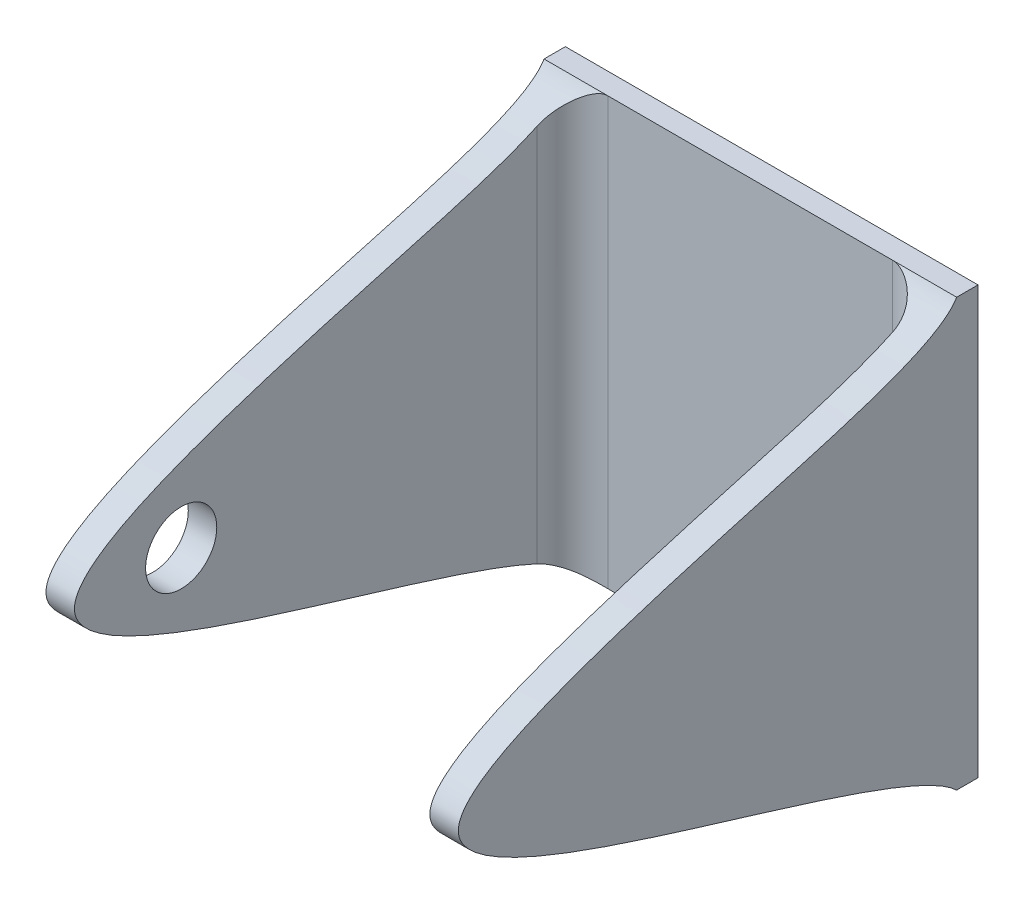
ISO-10303-21;
HEADER;
FILE_DESCRIPTION(('STEP AP214'),'2;1');
FILE_NAME('part.step','',(''),(''),'','','');
FILE_SCHEMA(('AUTOMOTIVE_DESIGN { 1 0 10303 214 1 1 1 1 }'));
ENDSEC;
DATA;
#1=APPLICATION_CONTEXT('core data for automotive mechanical design processes');
#2=APPLICATION_PROTOCOL_DEFINITION('international standard','automotive_design',2000,#1);
#3=PRODUCT_CONTEXT('',#1,'mechanical');
#4=PRODUCT('Part','Part','',(#3));
#5=PRODUCT_RELATED_PRODUCT_CATEGORY('part','',(#4));
#6=PRODUCT_DEFINITION_FORMATION('','',#4);
#7=PRODUCT_DEFINITION_CONTEXT('part definition',#1,'design');
#8=PRODUCT_DEFINITION('design','',#6,#7);
#9=PRODUCT_DEFINITION_SHAPE('','',#8);
#10=(LENGTH_UNIT() NAMED_UNIT(*) SI_UNIT(.MILLI.,.METRE.));
#11=(NAMED_UNIT(*) PLANE_ANGLE_UNIT() SI_UNIT($,.RADIAN.));
#12=(NAMED_UNIT(*) SI_UNIT($,.STERADIAN.) SOLID_ANGLE_UNIT());
#13=UNCERTAINTY_MEASURE_WITH_UNIT(LENGTH_MEASURE(1.E-05),#10,'distance_accuracy_value','');
#14=(GEOMETRIC_REPRESENTATION_CONTEXT(3) GLOBAL_UNCERTAINTY_ASSIGNED_CONTEXT((#13)) GLOBAL_UNIT_ASSIGNED_CONTEXT((#10,
#11,#12)) REPRESENTATION_CONTEXT('',''));
#15=CARTESIAN_POINT('',(0.,0.,0.));
#16=DIRECTION('',(0.,0.,1.));
#17=DIRECTION('',(1.,0.,0.));
#18=AXIS2_PLACEMENT_3D('',#15,#16,#17);
#19=CARTESIAN_POINT('',(54.,-30.,-28.));
#20=CARTESIAN_POINT('',(54.,-21.3411628219082,-18.9336377358154));
#21=CARTESIAN_POINT('',(54.,-4.31403427155989,78.5222740377525));
#22=CARTESIAN_POINT('',(54.,17.303381942778,5.87747126941268));
#23=CARTESIAN_POINT('',(54.,25.8559083263192,-25.6434168692004));
#24=CARTESIAN_POINT('',(54.,30.,-28.));
#25=B_SPLINE_CURVE_WITH_KNOTS('',3,(#19,#20,#21,#22,#23,#24),.UNSPECIFIED.,.F.,.F.,(4,1,1,4),
(0.,0.428019726830737,0.687018033348288,0.856039453661339),.UNSPECIFIED.);
#26=DIRECTION('',(-1.,0.,0.));
#27=VECTOR('',#26,1.);
#28=SURFACE_OF_LINEAR_EXTRUSION('',#25,#27);
#29=CARTESIAN_POINT('',(50.,-30.,-28.));
#30=CARTESIAN_POINT('',(50.,-21.3411628219082,-18.9336377358154));
#31=CARTESIAN_POINT('',(50.,-4.31403427155989,78.5222740377525));
#32=CARTESIAN_POINT('',(50.,17.303381942778,5.87747126941268));
#33=CARTESIAN_POINT('',(50.,25.8559083263192,-25.6434168692004));
#34=CARTESIAN_POINT('',(50.,30.,-28.));
#35=B_SPLINE_CURVE_WITH_KNOTS('',3,(#29,#30,#31,#32,#33,#34),.UNSPECIFIED.,.F.,.F.,(4,1,1,4),
(0.,0.428019726830737,0.687018033348288,0.856039453661339),.UNSPECIFIED.);
#36=CARTESIAN_POINT('',(50.,-26.9412195386749,-23.000000009792));
#37=VERTEX_POINT('',#36);
#38=CARTESIAN_POINT('',(50.,26.2475249459379,-23.0000000009633));
#39=VERTEX_POINT('',#38);
#40=EDGE_CURVE('E128',#37,#39,#35,.T.);
#41=ORIENTED_EDGE('',*,*,#40,.F.);
#42=CARTESIAN_POINT('',(50.,-26.9412195386749,-23.));
#43=CARTESIAN_POINT('',(50.0000117160011,-27.0147795908055,-23.1575731192041));
#44=CARTESIAN_POINT('',(49.9925522282463,-27.0892222165582,-23.3147142658124));
#45=CARTESIAN_POINT('',(49.963016026024,-27.2394914833208,-23.6269123851703));
#46=CARTESIAN_POINT('',(49.940942184411,-27.3153178494701,-23.7819697614315));
#47=CARTESIAN_POINT('',(49.8825419117092,-27.4678989267984,-24.0886344806616));
#48=CARTESIAN_POINT('',(49.8462348885658,-27.54465223648,-24.2402462254107));
#49=CARTESIAN_POINT('',(49.7597571732634,-27.6988109386271,-24.5391271766591));
#50=CARTESIAN_POINT('',(49.7095859845285,-27.776216354353,-24.6863962274059));
#51=CARTESIAN_POINT('',(49.5958249639765,-27.9312515603402,-24.9754785766169));
#52=CARTESIAN_POINT('',(49.5322385874477,-28.0088812877582,-25.1172932688362));
#53=CARTESIAN_POINT('',(49.392103659239,-28.1639393013261,-25.3944819321391));
#54=CARTESIAN_POINT('',(49.315555173984,-28.2413675885061,-25.5298559362237));
#55=CARTESIAN_POINT('',(49.1498884928284,-28.3956040762135,-25.7933257773995));
#56=CARTESIAN_POINT('',(49.0607562000774,-28.4724114777634,-25.9214132229178));
#57=CARTESIAN_POINT('',(48.8705356512579,-28.6246817114418,-26.169121201388));
#58=CARTESIAN_POINT('',(48.7694532378917,-28.7001451800548,-26.2887458266612));
#59=CARTESIAN_POINT('',(48.5551023528648,-28.8495253252407,-26.5194027057393));
#60=CARTESIAN_POINT('',(48.4417586291255,-28.9234286863763,-26.6303737622662));
#61=CARTESIAN_POINT('',(48.2039309585493,-29.0682512320066,-26.8418956324491));
#62=CARTESIAN_POINT('',(48.0794452819205,-29.139169950613,-26.9424448228593));
#63=CARTESIAN_POINT('',(47.8199519515766,-29.2767539877,-27.1320280591012));
#64=CARTESIAN_POINT('',(47.6849531866886,-29.343422814559,-27.2210716670854));
#65=CARTESIAN_POINT('',(47.4050196543633,-29.4709397501449,-27.3866095799844));
#66=CARTESIAN_POINT('',(47.260089869754,-29.5317907417517,-27.4631101138768));
#67=CARTESIAN_POINT('',(46.9076195774496,-29.6659209348757,-27.6271902023768));
#68=CARTESIAN_POINT('',(46.6960800448362,-29.7359717059695,-27.7091015968756));
#69=CARTESIAN_POINT('',(46.3683856640847,-29.8251848299667,-27.8104654017074));
#70=CARTESIAN_POINT('',(46.2575792051252,-29.8522529255426,-27.8406432723691));
#71=CARTESIAN_POINT('',(46.0329087051825,-29.9002606499834,-27.8935061584957));
#72=CARTESIAN_POINT('',(45.9190458725573,-29.9212026629829,-27.9161940893208));
#73=CARTESIAN_POINT('',(45.6723218365289,-29.9586202607353,-27.9563854212636));
#74=CARTESIAN_POINT('',(45.5390887449757,-29.9740162847385,-27.9726694026333));
#75=CARTESIAN_POINT('',(45.3378488823965,-29.9895408211396,-27.9890297402426));
#76=CARTESIAN_POINT('',(45.2704241752307,-29.9934542548447,-27.9931389957562));
#77=CARTESIAN_POINT('',(45.1353381638951,-29.9986868844087,-27.9986254593341));
#78=CARTESIAN_POINT('',(45.0676767802064,-30.0000051030139,-28.0000016382335));
#79=CARTESIAN_POINT('',(45.,-30.,-28.));
#80=B_SPLINE_CURVE_WITH_KNOTS('',3,(#42,#43,#44,#45,#46,#47,#48,#49,#50,#51,#52,#53,#54,#55,#56,
#57,#58,#59,#60,#61,#62,#63,#64,#65,#66,#67,#68,#69,#70,#71,#72,#73,#74,#75,#76,#77,#78,#79),
.UNSPECIFIED.,.F.,.F.,(4,2,2,2,2,2,2,2,2,2,2,2,2,2,2,2,2,2,4),(0.,0.521504358817784,
1.04290623198682,1.56359959619766,2.08431161261718,2.60488967501257,3.12546506976282,
3.64662832930587,4.16753782524387,4.6918482543847,5.21624022456333,5.74019353662685,
6.26388585653949,6.97300648933302,7.32661767201419,7.68009105347766,8.08453667991286,
8.28743401358142,8.49040773562018),.UNSPECIFIED.);
#81=CARTESIAN_POINT('',(45.,-30.,-28.));
#82=VERTEX_POINT('',#81);
#83=EDGE_CURVE('E169',#37,#82,#80,.T.);
#84=ORIENTED_EDGE('',*,*,#83,.T.);
#85=DIRECTION('',(-1.,0.,0.));
#86=VECTOR('',#85,1.);
#87=CARTESIAN_POINT('',(54.,-30.,-28.));
#88=LINE('',#87,#86);
#89=CARTESIAN_POINT('',(54.,-30.,-28.));
#90=VERTEX_POINT('',#89);
#91=EDGE_CURVE('E223',#90,#82,#88,.T.);
#92=ORIENTED_EDGE('',*,*,#91,.F.);
#93=CARTESIAN_POINT('',(54.,30.,-28.));
#94=VERTEX_POINT('',#93);
#95=EDGE_CURVE('E134',#90,#94,#25,.T.);
#96=ORIENTED_EDGE('',*,*,#95,.T.);
#97=DIRECTION('',(-1.,0.,0.));
#98=VECTOR('',#97,1.);
#99=CARTESIAN_POINT('',(54.,30.,-28.));
#100=LINE('',#99,#98);
#101=CARTESIAN_POINT('',(45.,30.,-28.));
#102=VERTEX_POINT('',#101);
#103=EDGE_CURVE('E142',#94,#102,#100,.T.);
#104=ORIENTED_EDGE('',*,*,#103,.T.);
#105=CARTESIAN_POINT('',(45.,30.,-28.));
#106=CARTESIAN_POINT('',(45.0426691158184,30.0000049472962,-28.0000009455298));
#107=CARTESIAN_POINT('',(45.0853302193427,29.999038901315,-27.9994536300829));
#108=CARTESIAN_POINT('',(45.1705293449486,29.9952101092854,-27.9972726282581));
#109=CARTESIAN_POINT('',(45.2130673943845,29.9923478235369,-27.9956392055253));
#110=CARTESIAN_POINT('',(45.3401116208745,29.9810066297073,-27.9891376902571));
#111=CARTESIAN_POINT('',(45.4243063140555,29.9697728381088,-27.9826682160128));
#112=CARTESIAN_POINT('',(45.5899253578675,29.9409783695667,-27.965765593086));
#113=CARTESIAN_POINT('',(45.6713720286543,29.92350908607,-27.9553895878134));
#114=CARTESIAN_POINT('',(45.8324095470346,29.883234429576,-27.9308959117813));
#115=CARTESIAN_POINT('',(45.9119987896025,29.8604246167834,-27.9167751265337));
#116=CARTESIAN_POINT('',(46.107532948195,29.7982887992741,-27.8772552868674));
#117=CARTESIAN_POINT('',(46.2222116522542,29.756342453008,-27.8497185097092));
#118=CARTESIAN_POINT('',(46.4468670789034,29.6657687594581,-27.7875019783987));
#119=CARTESIAN_POINT('',(46.556841830306,29.6171386466244,-27.7528192644836));
#120=CARTESIAN_POINT('',(46.7730971517173,29.514842444617,-27.6764705899954));
#121=CARTESIAN_POINT('',(46.8793405235946,29.4611387082648,-27.6347502705282));
#122=CARTESIAN_POINT('',(47.0873301639894,29.3504787498463,-27.5448751936608));
#123=CARTESIAN_POINT('',(47.1890750972342,29.2935215734072,-27.4967185426018));
#124=CARTESIAN_POINT('',(47.4312602201586,29.1521993043974,-27.3720388622946));
#125=CARTESIAN_POINT('',(47.569353898556,29.066656741818,-27.2922689219739));
#126=CARTESIAN_POINT('',(47.8362168967918,28.8929648551437,-27.1208044982998));
#127=CARTESIAN_POINT('',(47.964983005008,28.8048146477725,-27.0291059378416));
#128=CARTESIAN_POINT('',(48.2124099587237,28.6273806567765,-26.8347236861655));
#129=CARTESIAN_POINT('',(48.3310952353949,28.5381002535067,-26.7320679979981));
#130=CARTESIAN_POINT('',(48.5581562313395,28.3590093201318,-26.5162569279052));
#131=CARTESIAN_POINT('',(48.6665285473378,28.269198625343,-26.4030981041139));
#132=CARTESIAN_POINT('',(48.873115543043,28.0889180739024,-26.1660547148468));
#133=CARTESIAN_POINT('',(48.9712349274383,27.9984491852934,-26.0420863324205));
#134=CARTESIAN_POINT('',(49.155484839867,27.8181179347478,-25.7851279097656));
#135=CARTESIAN_POINT('',(49.2416155529561,27.7282555634694,-25.6521380088389));
#136=CARTESIAN_POINT('',(49.4011312893555,27.5495330496511,-25.3780634801548));
#137=CARTESIAN_POINT('',(49.4745152564128,27.4606729907373,-25.2369781828635));
#138=CARTESIAN_POINT('',(49.6077528991248,27.2843481455969,-24.9478043872282));
#139=CARTESIAN_POINT('',(49.667612278025,27.1968827857497,-24.7997188728138));
#140=CARTESIAN_POINT('',(49.7659930132186,27.0353494394355,-24.5180450470499));
#141=CARTESIAN_POINT('',(49.8063046530029,26.961068026462,-24.3852013708684));
#142=CARTESIAN_POINT('',(49.8758750838907,26.8139712439913,-24.1158775049534));
#143=CARTESIAN_POINT('',(49.9051356237362,26.7411556442697,-23.9793978942375));
#144=CARTESIAN_POINT('',(49.9522387207591,26.5971191464936,-23.7035076386075));
#145=CARTESIAN_POINT('',(49.9700721436913,26.5258995679864,-23.5640947406776));
#146=CARTESIAN_POINT('',(49.9939598778103,26.385286449578,-23.2832929491251));
#147=CARTESIAN_POINT('',(50.0000100185304,26.315893564769,-23.1419033737212));
#148=CARTESIAN_POINT('',(50.,26.2475249455742,-23.0000000002086));
#149=B_SPLINE_CURVE_WITH_KNOTS('',3,(#105,#106,#107,#108,#109,#110,#111,#112,#113,#114,#115,
#116,#117,#118,#119,#120,#121,#122,#123,#124,#125,#126,#127,#128,#129,#130,#131,#132,#133,#134,
#135,#136,#137,#138,#139,#140,#141,#142,#143,#144,#145,#146,#147,#148),.UNSPECIFIED.,.F.,.F.,(4,
2,2,2,2,2,2,2,2,2,2,2,2,2,2,2,2,2,2,2,2,4),(0.,0.127977737671946,0.255924420958181,
0.511046138065065,0.762572521634646,1.0143087562917,1.38922089480677,1.76428863081029,
2.14239851190252,2.52061988411714,3.06280608833806,3.60517809667851,4.14619573397683,
4.68739129233744,5.23323772995695,5.77907574102934,6.32495896115763,6.87061155386402,
7.34253901821671,7.81439177276792,8.28662123298589,8.75901779941286),.UNSPECIFIED.);
#150=EDGE_CURVE('E161',#102,#39,#149,.T.);
#151=ORIENTED_EDGE('',*,*,#150,.T.);
#152=EDGE_LOOP('',(#41,#84,#92,#96,#104,#151));
#153=FACE_BOUND('',#152,.T.);
#154=ADVANCED_FACE('F39',(#153),#28,.T.);
#155=CARTESIAN_POINT('',(54.,-5.05749530627274E-12,42.0425119087922));
#156=DIRECTION('',(-1.,0.,0.));
#157=DIRECTION('',(0.,0.,1.));
#158=AXIS2_PLACEMENT_3D('',#155,#156,#157);
#159=PLANE('',#158);
#160=ORIENTED_EDGE('',*,*,#95,.F.);
#161=DIRECTION('',(0.,0.,1.));
#162=VECTOR('',#161,1.);
#163=CARTESIAN_POINT('',(54.,-30.,-31.));
#164=LINE('',#163,#162);
#165=CARTESIAN_POINT('',(54.,-30.,-31.));
#166=VERTEX_POINT('',#165);
#167=EDGE_CURVE('E212',#166,#90,#164,.T.);
#168=ORIENTED_EDGE('',*,*,#167,.F.);
#169=DIRECTION('',(0.,-1.,0.));
#170=VECTOR('',#169,1.);
#171=CARTESIAN_POINT('',(54.,-30.,-31.));
#172=LINE('',#171,#170);
#173=CARTESIAN_POINT('',(54.,30.,-31.));
#174=VERTEX_POINT('',#173);
#175=EDGE_CURVE('E123',#174,#166,#172,.T.);
#176=ORIENTED_EDGE('',*,*,#175,.F.);
#177=DIRECTION('',(0.,0.,1.));
#178=VECTOR('',#177,1.);
#179=CARTESIAN_POINT('',(54.,30.,-31.));
#180=LINE('',#179,#178);
#181=EDGE_CURVE('E135',#174,#94,#180,.T.);
#182=ORIENTED_EDGE('',*,*,#181,.T.);
#183=EDGE_LOOP('',(#160,#168,#176,#182));
#184=FACE_BOUND('',#183,.T.);
#185=ADVANCED_FACE('F153',(#184),#159,.F.);
#186=CARTESIAN_POINT('',(50.,-5.05749530627274E-12,42.0425119087922));
#187=DIRECTION('',(-1.,0.,0.));
#188=DIRECTION('',(0.,0.,1.));
#189=AXIS2_PLACEMENT_3D('',#186,#187,#188);
#190=PLANE('',#189);
#191=ORIENTED_EDGE('',*,*,#40,.T.);
#192=DIRECTION('',(0.,1.,0.));
#193=VECTOR('',#192,1.);
#194=CARTESIAN_POINT('',(50.,-30.,-23.));
#195=LINE('',#194,#193);
#196=EDGE_CURVE('E234',#39,#37,#195,.F.);
#197=ORIENTED_EDGE('',*,*,#196,.T.);
#198=EDGE_LOOP('',(#191,#197));
#199=FACE_BOUND('',#198,.T.);
#200=ADVANCED_FACE('F154',(#199),#190,.T.);
#201=CARTESIAN_POINT('',(-4.,-30.,-31.));
#202=DIRECTION('',(0.,1.,0.));
#203=DIRECTION('',(0.,0.,1.));
#204=AXIS2_PLACEMENT_3D('',#201,#202,#203);
#205=PLANE('',#204);
#206=ORIENTED_EDGE('',*,*,#91,.T.);
#207=DIRECTION('',(-1.,0.,0.));
#208=VECTOR('',#207,1.);
#209=CARTESIAN_POINT('',(-4.,-30.,-28.));
#210=LINE('',#209,#208);
#211=CARTESIAN_POINT('',(5.,-30.,-28.));
#212=VERTEX_POINT('',#211);
#213=EDGE_CURVE('E209',#82,#212,#210,.T.);
#214=ORIENTED_EDGE('',*,*,#213,.T.);
#215=DIRECTION('',(1.,0.,0.));
#216=VECTOR('',#215,1.);
#217=CARTESIAN_POINT('',(-4.,-30.,-28.));
#218=LINE('',#217,#216);
#219=CARTESIAN_POINT('',(-4.,-30.,-28.));
#220=VERTEX_POINT('',#219);
#221=EDGE_CURVE('E129',#220,#212,#218,.T.);
#222=ORIENTED_EDGE('',*,*,#221,.F.);
#223=DIRECTION('',(0.,0.,1.));
#224=VECTOR('',#223,1.);
#225=CARTESIAN_POINT('',(-4.,-30.,-31.));
#226=LINE('',#225,#224);
#227=CARTESIAN_POINT('',(-4.,-30.,-31.));
#228=VERTEX_POINT('',#227);
#229=EDGE_CURVE('E109',#228,#220,#226,.T.);
#230=ORIENTED_EDGE('',*,*,#229,.F.);
#231=DIRECTION('',(-1.,0.,0.));
#232=VECTOR('',#231,1.);
#233=CARTESIAN_POINT('',(-4.,-30.,-31.));
#234=LINE('',#233,#232);
#235=EDGE_CURVE('E116',#166,#228,#234,.T.);
#236=ORIENTED_EDGE('',*,*,#235,.F.);
#237=ORIENTED_EDGE('',*,*,#167,.T.);
#238=EDGE_LOOP('',(#206,#214,#222,#230,#236,#237));
#239=FACE_BOUND('',#238,.T.);
#240=ADVANCED_FACE('F127',(#239),#205,.F.);
#241=CARTESIAN_POINT('',(-4.,-30.,-31.));
#242=DIRECTION('',(1.,0.,0.));
#243=DIRECTION('',(0.,0.,-1.));
#244=AXIS2_PLACEMENT_3D('',#241,#242,#243);
#245=PLANE('',#244);
#246=CARTESIAN_POINT('',(-4.,-1.90736495911384E-05,26.9999999999974));
#247=DIRECTION('',(1.,0.,0.));
#248=DIRECTION('',(0.,0.,-1.));
#249=AXIS2_PLACEMENT_3D('',#246,#247,#248);
#250=CIRCLE('',#249,5.);
#251=CARTESIAN_POINT('',(-4.,-1.90736495911384E-05,21.9999999999974));
#252=VERTEX_POINT('',#251);
#253=EDGE_CURVE('E196',#252,#252,#250,.T.);
#254=ORIENTED_EDGE('',*,*,#253,.T.);
#255=EDGE_LOOP('',(#254));
#256=FACE_BOUND('',#255,.T.);
#257=ORIENTED_EDGE('',*,*,#229,.T.);
#258=CARTESIAN_POINT('',(-4.,-30.,-28.));
#259=CARTESIAN_POINT('',(-4.,-21.3578663524738,-18.897902419508));
#260=CARTESIAN_POINT('',(-4.,-4.58867636675101,78.4276002941651));
#261=CARTESIAN_POINT('',(-4.,17.7926577507313,5.89075068527331));
#262=CARTESIAN_POINT('',(-4.,25.8559083263192,-25.6434168692004));
#263=CARTESIAN_POINT('',(-4.,30.,-28.));
#264=B_SPLINE_CURVE_WITH_KNOTS('',3,(#258,#259,#260,#261,#262,#263),.UNSPECIFIED.,.F.,.F.,(4,1,
1,4),(0.,0.428019726830737,0.687018033348288,0.856039453661339),.UNSPECIFIED.);
#265=CARTESIAN_POINT('',(-4.,30.,-28.));
#266=VERTEX_POINT('',#265);
#267=EDGE_CURVE('E193',#220,#266,#264,.T.);
#268=ORIENTED_EDGE('',*,*,#267,.T.);
#269=DIRECTION('',(0.,0.,1.));
#270=VECTOR('',#269,1.);
#271=CARTESIAN_POINT('',(-4.,30.,-31.));
#272=LINE('',#271,#270);
#273=CARTESIAN_POINT('',(-4.,30.,-31.));
#274=VERTEX_POINT('',#273);
#275=EDGE_CURVE('E115',#274,#266,#272,.T.);
#276=ORIENTED_EDGE('',*,*,#275,.F.);
#277=DIRECTION('',(0.,1.,0.));
#278=VECTOR('',#277,1.);
#279=CARTESIAN_POINT('',(-4.,-30.,-31.));
#280=LINE('',#279,#278);
#281=EDGE_CURVE('E104',#228,#274,#280,.T.);
#282=ORIENTED_EDGE('',*,*,#281,.F.);
#283=EDGE_LOOP('',(#257,#268,#276,#282));
#284=FACE_BOUND('',#283,.T.);
#285=ADVANCED_FACE('F110',(#256,#284),#245,.F.);
#286=CARTESIAN_POINT('',(-4.,30.,-31.));
#287=DIRECTION('',(0.,-1.,0.));
#288=DIRECTION('',(0.,0.,-1.));
#289=AXIS2_PLACEMENT_3D('',#286,#287,#288);
#290=PLANE('',#289);
#291=DIRECTION('',(1.,0.,0.));
#292=VECTOR('',#291,1.);
#293=CARTESIAN_POINT('',(-4.,30.,-28.));
#294=LINE('',#293,#292);
#295=CARTESIAN_POINT('',(5.,30.,-28.));
#296=VERTEX_POINT('',#295);
#297=EDGE_CURVE('E61',#266,#296,#294,.T.);
#298=ORIENTED_EDGE('',*,*,#297,.T.);
#299=EDGE_CURVE('E216',#296,#102,#294,.T.);
#300=ORIENTED_EDGE('',*,*,#299,.T.);
#301=ORIENTED_EDGE('',*,*,#103,.F.);
#302=ORIENTED_EDGE('',*,*,#181,.F.);
#303=DIRECTION('',(1.,0.,0.));
#304=VECTOR('',#303,1.);
#305=CARTESIAN_POINT('',(-4.,30.,-31.));
#306=LINE('',#305,#304);
#307=EDGE_CURVE('E113',#274,#174,#306,.T.);
#308=ORIENTED_EDGE('',*,*,#307,.F.);
#309=ORIENTED_EDGE('',*,*,#275,.T.);
#310=EDGE_LOOP('',(#298,#300,#301,#302,#308,#309));
#311=FACE_BOUND('',#310,.T.);
#312=ADVANCED_FACE('F224',(#311),#290,.F.);
#313=CARTESIAN_POINT('',(0.,0.,-31.));
#314=DIRECTION('',(0.,0.,1.));
#315=DIRECTION('',(1.,0.,0.));
#316=AXIS2_PLACEMENT_3D('',#313,#314,#315);
#317=PLANE('',#316);
#318=ORIENTED_EDGE('',*,*,#235,.T.);
#319=ORIENTED_EDGE('',*,*,#281,.T.);
#320=ORIENTED_EDGE('',*,*,#307,.T.);
#321=ORIENTED_EDGE('',*,*,#175,.T.);
#322=EDGE_LOOP('',(#318,#319,#320,#321));
#323=FACE_BOUND('',#322,.T.);
#324=ADVANCED_FACE('F118',(#323),#317,.F.);
#325=CARTESIAN_POINT('',(0.,0.,-28.));
#326=DIRECTION('',(0.,0.,1.));
#327=DIRECTION('',(1.,0.,0.));
#328=AXIS2_PLACEMENT_3D('',#325,#326,#327);
#329=PLANE('',#328);
#330=ORIENTED_EDGE('',*,*,#213,.F.);
#331=DIRECTION('',(0.,1.,0.));
#332=VECTOR('',#331,1.);
#333=CARTESIAN_POINT('',(45.,30.,-28.));
#334=LINE('',#333,#332);
#335=EDGE_CURVE('E233',#82,#102,#334,.T.);
#336=ORIENTED_EDGE('',*,*,#335,.T.);
#337=ORIENTED_EDGE('',*,*,#299,.F.);
#338=DIRECTION('',(0.,1.,0.));
#339=VECTOR('',#338,1.);
#340=CARTESIAN_POINT('',(5.,0.,-28.));
#341=LINE('',#340,#339);
#342=EDGE_CURVE('E227',#296,#212,#341,.F.);
#343=ORIENTED_EDGE('',*,*,#342,.T.);
#344=EDGE_LOOP('',(#330,#336,#337,#343));
#345=FACE_BOUND('',#344,.T.);
#346=ADVANCED_FACE('F186',(#345),#329,.T.);
#347=DIRECTION('',(1.,0.,0.));
#348=VECTOR('',#347,1.);
#349=SURFACE_OF_LINEAR_EXTRUSION('',#264,#348);
#350=ORIENTED_EDGE('',*,*,#221,.T.);
#351=CARTESIAN_POINT('',(5.,-30.,-28.));
#352=CARTESIAN_POINT('',(4.93974835091552,-30.0000031837496,-28.0000010303274));
#353=CARTESIAN_POINT('',(4.87950704509301,-29.9989654326858,-27.9989106045321));
#354=CARTESIAN_POINT('',(4.75917968844375,-29.9948390679686,-27.9945598999395));
#355=CARTESIAN_POINT('',(4.69909362119014,-29.9917506810459,-27.9912998610277));
#356=CARTESIAN_POINT('',(4.51944936663635,-29.97946934121,-27.9782989673101));
#357=CARTESIAN_POINT('',(4.40030401128259,-29.9672600033234,-27.965337241032));
#358=CARTESIAN_POINT('',(4.16537758528943,-29.9355581031451,-27.9312647893331));
#359=CARTESIAN_POINT('',(4.04957537305224,-29.9161353840036,-27.910232147199));
#360=CARTESIAN_POINT('',(3.82091898632646,-29.8708349005387,-27.8603976036624));
#361=CARTESIAN_POINT('',(3.7080657634324,-29.8449550803407,-27.8315932275814));
#362=CARTESIAN_POINT('',(3.48656058222364,-29.7878329040178,-27.7668378450261));
#363=CARTESIAN_POINT('',(3.37788874623516,-29.7566211777128,-27.7309274828729));
#364=CARTESIAN_POINT('',(3.16452687606314,-29.6896307313819,-27.6523081142026));
#365=CARTESIAN_POINT('',(3.05983659030524,-29.6538523005275,-27.609599538118));
#366=CARTESIAN_POINT('',(2.75164967479915,-29.5406921580066,-27.4716488361633));
#367=CARTESIAN_POINT('',(2.55449735436741,-29.4576104334756,-27.3667188440903));
#368=CARTESIAN_POINT('',(2.15090744053889,-29.2683374965212,-27.1166986188108));
#369=CARTESIAN_POINT('',(1.94751520649146,-29.160549280792,-26.9679448874692));
#370=CARTESIAN_POINT('',(1.56772293055822,-28.9371838496717,-26.6444045254974));
#371=CARTESIAN_POINT('',(1.39131921694314,-28.8216076968998,-26.4696214424999));
#372=CARTESIAN_POINT('',(1.03629001556705,-28.5635200767631,-26.0619274639706));
#373=CARTESIAN_POINT('',(0.863728129864025,-28.4200942321541,-25.8242974865456));
#374=CARTESIAN_POINT('',(0.562928997533107,-28.1311168903974,-25.3233031114201));
#375=CARTESIAN_POINT('',(0.43471920034517,-27.985564134772,-25.0599229057982));
#376=CARTESIAN_POINT('',(0.276195929778329,-27.7653816884366,-24.6458133428218));
#377=CARTESIAN_POINT('',(0.228446312103028,-27.6902839757609,-24.5017752430425));
#378=CARTESIAN_POINT('',(0.146150465236773,-27.5407175289972,-24.2096105282843));
#379=CARTESIAN_POINT('',(0.111604316984968,-27.4662487987676,-24.0614838882481));
#380=CARTESIAN_POINT('',(0.0560873749408261,-27.3182903545258,-23.7621699542603));
#381=CARTESIAN_POINT('',(0.0351211131421093,-27.2448009753564,-23.6109816558877));
#382=CARTESIAN_POINT('',(0.00707176102882445,-27.099148688402,-23.306666017405));
#383=CARTESIAN_POINT('',(-9.32847159112101E-06,-27.0269859732695,-23.1535384010438));
#384=CARTESIAN_POINT('',(0.,-26.9556583075598,-23.0000000018503));
#385=B_SPLINE_CURVE_WITH_KNOTS('',3,(#351,#352,#353,#354,#355,#356,#357,#358,#359,#360,#361,
#362,#363,#364,#365,#366,#367,#368,#369,#370,#371,#372,#373,#374,#375,#376,#377,#378,#379,#380,
#381,#382,#383,#384),.UNSPECIFIED.,.F.,.F.,(4,2,2,2,2,2,2,2,2,2,2,2,2,2,2,2,4),(0.,
0.180716011656335,0.361412045593258,0.722203442985956,1.07958889785719,1.4370882861141,
1.79259908681847,2.14808738711662,2.86053824810927,3.67988849809463,4.49912717795237,
5.47549999978847,6.45247602069956,6.95994063151104,7.46740835310294,7.97504534393766,
8.48275547845664),.UNSPECIFIED.);
#386=CARTESIAN_POINT('',(0.,-26.9556583110399,-23.0000000093408));
#387=VERTEX_POINT('',#386);
#388=EDGE_CURVE('E11',#212,#387,#385,.T.);
#389=ORIENTED_EDGE('',*,*,#388,.T.);
#390=CARTESIAN_POINT('',(0.,-30.,-28.));
#391=CARTESIAN_POINT('',(0.,-21.3578663524738,-18.897902419508));
#392=CARTESIAN_POINT('',(0.,-4.58867636675101,78.4276002941651));
#393=CARTESIAN_POINT('',(0.,17.7926577507313,5.89075068527331));
#394=CARTESIAN_POINT('',(0.,25.8559083263192,-25.6434168692004));
#395=CARTESIAN_POINT('',(0.,30.,-28.));
#396=B_SPLINE_CURVE_WITH_KNOTS('',3,(#390,#391,#392,#393,#394,#395),.UNSPECIFIED.,.F.,.F.,(4,1,
1,4),(0.,0.428019726830737,0.687018033348288,0.856039453661339),.UNSPECIFIED.);
#397=CARTESIAN_POINT('',(0.,26.2959637835567,-23.0000000009408));
#398=VERTEX_POINT('',#397);
#399=EDGE_CURVE('E197',#387,#398,#396,.T.);
#400=ORIENTED_EDGE('',*,*,#399,.T.);
#401=CARTESIAN_POINT('',(0.,26.2959637835567,-23.));
#402=CARTESIAN_POINT('',(-1.66001315784281E-05,26.3708050447485,-23.1591416491474));
#403=CARTESIAN_POINT('',(0.00759627386749917,26.4469487502296,-23.3176400817191));
#404=CARTESIAN_POINT('',(0.0375988491497942,26.6015495583943,-23.6320229628814));
#405=CARTESIAN_POINT('',(0.0599832310990199,26.6800058185965,-23.7879083317433));
#406=CARTESIAN_POINT('',(0.118968314229564,26.83878167508,-24.0954417019129));
#407=CARTESIAN_POINT('',(0.155530795092685,26.9190957205184,-24.2470999301965));
#408=CARTESIAN_POINT('',(0.242305406730764,27.0815325183173,-24.545470640562));
#409=CARTESIAN_POINT('',(0.292518512474094,27.163655399485,-24.692182768537));
#410=CARTESIAN_POINT('',(0.405900294097381,27.3293356063878,-24.9794091654822));
#411=CARTESIAN_POINT('',(0.469053789019096,27.4128911471019,-25.1199304646023));
#412=CARTESIAN_POINT('',(0.607704285119018,27.5812681711787,-25.394020524916));
#413=CARTESIAN_POINT('',(0.68320539937511,27.6660900677886,-25.5275869497798));
#414=CARTESIAN_POINT('',(0.845874425686878,27.8366879883279,-25.7868755249645));
#415=CARTESIAN_POINT('',(0.933047576767509,27.9224644247602,-25.9125941153928));
#416=CARTESIAN_POINT('',(1.11832864214043,28.0945566518088,-26.155303377756));
#417=CARTESIAN_POINT('',(1.21643688500022,28.1808724585579,-26.272293787258));
#418=CARTESIAN_POINT('',(1.4276668724589,28.3575652056452,-26.5019840460091));
#419=CARTESIAN_POINT('',(1.54127259459396,28.4479456921946,-26.6142365712571));
#420=CARTESIAN_POINT('',(1.77892934186016,28.6280548716364,-26.82755742175));
#421=CARTESIAN_POINT('',(1.90297694742789,28.7177837675389,-26.9286293835658));
#422=CARTESIAN_POINT('',(2.16109239887109,28.8957285895369,-27.1190241457544));
#423=CARTESIAN_POINT('',(2.29517194179727,28.9839425972503,-27.2083328848245));
#424=CARTESIAN_POINT('',(2.57278416582079,29.157240306353,-27.3743313568217));
#425=CARTESIAN_POINT('',(2.71631221349843,29.242325510626,-27.4510272113323));
#426=CARTESIAN_POINT('',(2.9489493300889,29.3714940150191,-27.5609106351755));
#427=CARTESIAN_POINT('',(3.03490115637907,29.4174669899751,-27.5986194988293));
#428=CARTESIAN_POINT('',(3.20990118014651,29.5069112407523,-27.6695243557895));
#429=CARTESIAN_POINT('',(3.29894858606608,29.5503831486715,-27.7027214922654));
#430=CARTESIAN_POINT('',(3.47966089821012,29.633659005722,-27.7642021627526));
#431=CARTESIAN_POINT('',(3.57130579590106,29.673484324233,-27.7925153156166));
#432=CARTESIAN_POINT('',(3.75784766100628,29.7485630863817,-27.8442153926054));
#433=CARTESIAN_POINT('',(3.85274488927696,29.7838161622082,-27.8676019205053));
#434=CARTESIAN_POINT('',(4.03219692119648,29.8436254542266,-27.9061752893832));
#435=CARTESIAN_POINT('',(4.11633235666644,29.8689886350307,-27.922052448982));
#436=CARTESIAN_POINT('',(4.28677637421129,29.9139173125132,-27.9496210817425));
#437=CARTESIAN_POINT('',(4.37308295531431,29.9334879496042,-27.9613162679965));
#438=CARTESIAN_POINT('',(4.50451460483153,29.9576978368685,-27.9755882573481));
#439=CARTESIAN_POINT('',(4.54899262817797,29.9649443361731,-27.9798194117455));
#440=CARTESIAN_POINT('',(4.63832008605737,29.9774899408226,-27.9871028502015));
#441=CARTESIAN_POINT('',(4.68316949650628,29.98278917145,-27.9901552101014));
#442=CARTESIAN_POINT('',(4.77327314136734,29.9913351330763,-27.9950611323712));
#443=CARTESIAN_POINT('',(4.81852820718497,29.9945753250881,-27.9969108759607));
#444=CARTESIAN_POINT('',(4.90918770070261,29.9989124660649,-27.999381505551));
#445=CARTESIAN_POINT('',(4.9545921697149,30.000008761625,-28.0000020169142));
#446=CARTESIAN_POINT('',(5.,30.,-28.));
#447=B_SPLINE_CURVE_WITH_KNOTS('',3,(#401,#402,#403,#404,#405,#406,#407,#408,#409,#410,#411,
#412,#413,#414,#415,#416,#417,#418,#419,#420,#421,#422,#423,#424,#425,#426,#427,#428,#429,#430,
#431,#432,#433,#434,#435,#436,#437,#438,#439,#440,#441,#442,#443,#444,#445,#446),.UNSPECIFIED.,
.F.,.F.,(4,2,2,2,2,2,2,2,2,2,2,2,2,2,2,2,2,2,2,2,2,2,4),(0.,0.527373850930689,1.054557894027,
1.58033056182217,2.10614079174099,2.63133766565201,3.15670984396986,3.68231863249599,
4.20794321828723,4.75783045869795,5.30753831453666,5.85789741913812,6.40798861704449,
6.72138870809669,7.03470924202261,7.34605719814338,7.65743018494752,7.9250708400407,
8.19247326871498,8.32821210287761,8.46394220240082,8.60010122024427,8.7363017294067),.UNSPECIFIED.);
#448=EDGE_CURVE('E53',#398,#296,#447,.T.);
#449=ORIENTED_EDGE('',*,*,#448,.T.);
#450=ORIENTED_EDGE('',*,*,#297,.F.);
#451=ORIENTED_EDGE('',*,*,#267,.F.);
#452=EDGE_LOOP('',(#350,#389,#400,#449,#450,#451));
#453=FACE_BOUND('',#452,.T.);
#454=ADVANCED_FACE('F179',(#453),#349,.F.);
#455=CARTESIAN_POINT('',(0.,-1.90736547328842E-05,41.9999999999973));
#456=DIRECTION('',(-1.,0.,0.));
#457=DIRECTION('',(0.,0.,1.));
#458=AXIS2_PLACEMENT_3D('',#455,#456,#457);
#459=PLANE('',#458);
#460=CARTESIAN_POINT('',(0.,-1.90736495911384E-05,26.9999999999974));
#461=DIRECTION('',(1.,0.,0.));
#462=DIRECTION('',(0.,0.,-1.));
#463=AXIS2_PLACEMENT_3D('',#460,#461,#462);
#464=CIRCLE('',#463,5.);
#465=CARTESIAN_POINT('',(0.,-1.90736495911384E-05,21.9999999999974));
#466=VERTEX_POINT('',#465);
#467=EDGE_CURVE('E257',#466,#466,#464,.T.);
#468=ORIENTED_EDGE('',*,*,#467,.F.);
#469=EDGE_LOOP('',(#468));
#470=FACE_BOUND('',#469,.T.);
#471=ORIENTED_EDGE('',*,*,#399,.F.);
#472=DIRECTION('',(0.,1.,0.));
#473=VECTOR('',#472,1.);
#474=CARTESIAN_POINT('',(0.,-1.90736547328842E-05,-23.));
#475=LINE('',#474,#473);
#476=EDGE_CURVE('E232',#387,#398,#475,.T.);
#477=ORIENTED_EDGE('',*,*,#476,.T.);
#478=EDGE_LOOP('',(#471,#477));
#479=FACE_BOUND('',#478,.T.);
#480=ADVANCED_FACE('F183',(#470,#479),#459,.F.);
#481=CARTESIAN_POINT('',(45.,0.,-23.));
#482=DIRECTION('',(0.,-1.,0.));
#483=DIRECTION('',(0.,0.,-1.));
#484=AXIS2_PLACEMENT_3D('',#481,#482,#483);
#485=CYLINDRICAL_SURFACE('',#484,5.);
#486=ORIENTED_EDGE('',*,*,#83,.F.);
#487=ORIENTED_EDGE('',*,*,#196,.F.);
#488=ORIENTED_EDGE('',*,*,#150,.F.);
#489=ORIENTED_EDGE('',*,*,#335,.F.);
#490=EDGE_LOOP('',(#486,#487,#488,#489));
#491=FACE_BOUND('',#490,.T.);
#492=ADVANCED_FACE('F160',(#491),#485,.F.);
#493=CARTESIAN_POINT('',(5.,-1.90736547328842E-05,-23.));
#494=DIRECTION('',(0.,1.,0.));
#495=DIRECTION('',(0.,0.,1.));
#496=AXIS2_PLACEMENT_3D('',#493,#494,#495);
#497=CYLINDRICAL_SURFACE('',#496,5.);
#498=ORIENTED_EDGE('',*,*,#388,.F.);
#499=ORIENTED_EDGE('',*,*,#342,.F.);
#500=ORIENTED_EDGE('',*,*,#448,.F.);
#501=ORIENTED_EDGE('',*,*,#476,.F.);
#502=EDGE_LOOP('',(#498,#499,#500,#501));
#503=FACE_BOUND('',#502,.T.);
#504=ADVANCED_FACE('F41',(#503),#497,.F.);
#505=CARTESIAN_POINT('',(-5.,-1.90736495911384E-05,26.9999999999974));
#506=DIRECTION('',(1.,0.,0.));
#507=DIRECTION('',(0.,0.,-1.));
#508=AXIS2_PLACEMENT_3D('',#505,#506,#507);
#509=CYLINDRICAL_SURFACE('',#508,5.);
#510=ORIENTED_EDGE('',*,*,#467,.T.);
#511=EDGE_LOOP('',(#510));
#512=FACE_BOUND('',#511,.T.);
#513=ORIENTED_EDGE('',*,*,#253,.F.);
#514=EDGE_LOOP('',(#513));
#515=FACE_BOUND('',#514,.T.);
#516=ADVANCED_FACE('F266',(#512,#515),#509,.F.);
#517=CLOSED_SHELL('',(#154,#185,#200,#240,#285,#312,#324,#346,#454,#480,#492,#504,#516));
#518=MANIFOLD_SOLID_BREP('B2',#517);
#519=ADVANCED_BREP_SHAPE_REPRESENTATION('',(#18,#518),#14);
#520=SHAPE_DEFINITION_REPRESENTATION(#9,#519);
ENDSEC;
END-ISO-10303-21;
